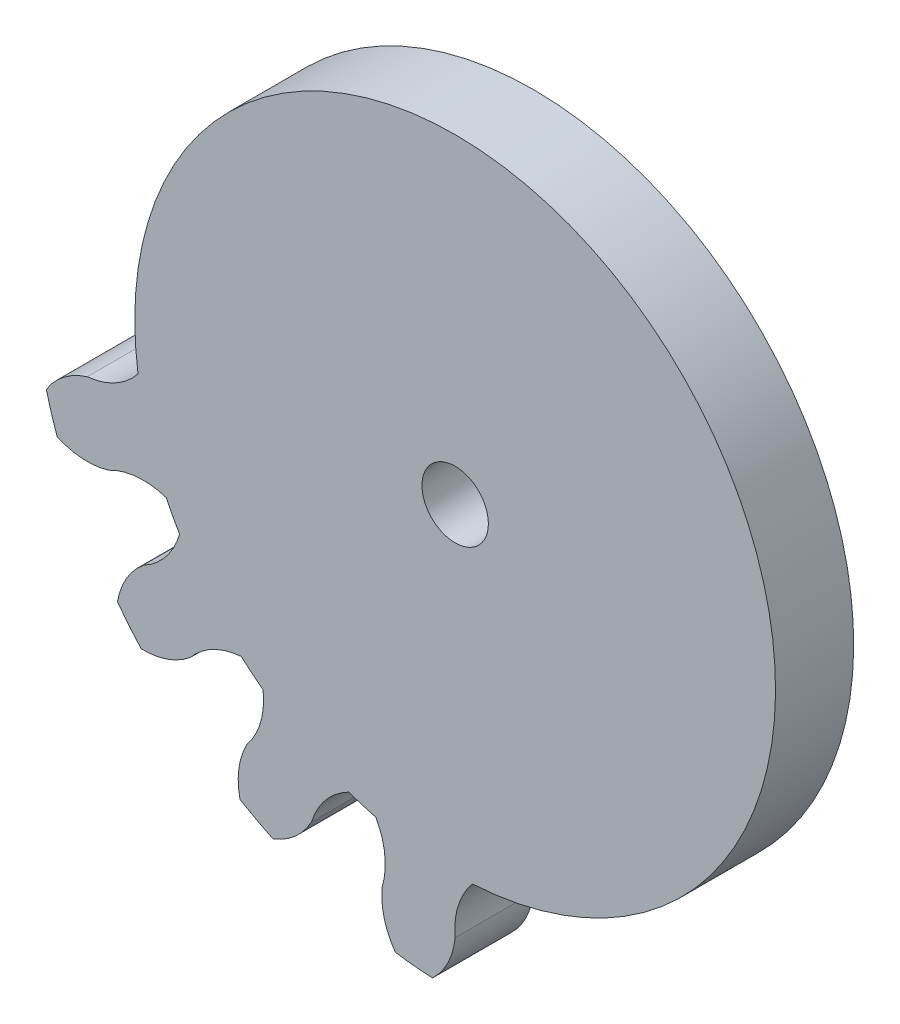
ISO-10303-21;
HEADER;
FILE_DESCRIPTION(('STEP AP214'),'2;1');
FILE_NAME('part.step','',(''),(''),'','','');
FILE_SCHEMA(('AUTOMOTIVE_DESIGN { 1 0 10303 214 1 1 1 1 }'));
ENDSEC;
DATA;
#1=APPLICATION_CONTEXT('core data for automotive mechanical design processes');
#2=APPLICATION_PROTOCOL_DEFINITION('international standard','automotive_design',2000,#1);
#3=PRODUCT_CONTEXT('',#1,'mechanical');
#4=PRODUCT('Part','Part','',(#3));
#5=PRODUCT_RELATED_PRODUCT_CATEGORY('part','',(#4));
#6=PRODUCT_DEFINITION_FORMATION('','',#4);
#7=PRODUCT_DEFINITION_CONTEXT('part definition',#1,'design');
#8=PRODUCT_DEFINITION('design','',#6,#7);
#9=PRODUCT_DEFINITION_SHAPE('','',#8);
#10=(LENGTH_UNIT() NAMED_UNIT(*) SI_UNIT(.MILLI.,.METRE.));
#11=(NAMED_UNIT(*) PLANE_ANGLE_UNIT() SI_UNIT($,.RADIAN.));
#12=(NAMED_UNIT(*) SI_UNIT($,.STERADIAN.) SOLID_ANGLE_UNIT());
#13=UNCERTAINTY_MEASURE_WITH_UNIT(LENGTH_MEASURE(1.E-05),#10,'distance_accuracy_value','');
#14=(GEOMETRIC_REPRESENTATION_CONTEXT(3) GLOBAL_UNCERTAINTY_ASSIGNED_CONTEXT((#13)) GLOBAL_UNIT_ASSIGNED_CONTEXT((#10,
#11,#12)) REPRESENTATION_CONTEXT('',''));
#15=CARTESIAN_POINT('',(0.,0.,0.));
#16=DIRECTION('',(0.,0.,1.));
#17=DIRECTION('',(1.,0.,0.));
#18=AXIS2_PLACEMENT_3D('',#15,#16,#17);
#19=CARTESIAN_POINT('',(0.,0.,10.));
#20=DIRECTION('',(0.,0.,1.));
#21=DIRECTION('',(1.,0.,0.));
#22=AXIS2_PLACEMENT_3D('',#19,#20,#21);
#23=PLANE('',#22);
#24=CARTESIAN_POINT('',(0.,0.,10.));
#25=DIRECTION('',(0.,0.,1.));
#26=DIRECTION('',(1.,0.,0.));
#27=AXIS2_PLACEMENT_3D('',#24,#25,#26);
#28=CIRCLE('',#27,4.25);
#29=CARTESIAN_POINT('',(4.25,0.,10.));
#30=VERTEX_POINT('',#29);
#31=EDGE_CURVE('E409',#30,#30,#28,.T.);
#32=ORIENTED_EDGE('',*,*,#31,.F.);
#33=EDGE_LOOP('',(#32));
#34=FACE_BOUND('',#33,.T.);
#35=CARTESIAN_POINT('',(9.37946745444333,-47.0746809895833,10.));
#36=DIRECTION('',(0.,0.,1.));
#37=DIRECTION('',(-1.,0.,0.));
#38=AXIS2_PLACEMENT_3D('',#35,#36,#37);
#39=CIRCLE('',#38,9.425);
#40=CARTESIAN_POINT('',(2.22645157509393,-40.9375001359849,10.));
#41=VERTEX_POINT('',#40);
#42=CARTESIAN_POINT('',(0.,-48.,10.));
#43=VERTEX_POINT('',#42);
#44=EDGE_CURVE('E335',#41,#43,#39,.T.);
#45=ORIENTED_EDGE('',*,*,#44,.F.);
#46=CARTESIAN_POINT('',(0.,0.,10.));
#47=DIRECTION('',(0.,0.,-1.));
#48=DIRECTION('',(1.,0.,0.));
#49=AXIS2_PLACEMENT_3D('',#46,#47,#48);
#50=CIRCLE('',#49,40.998);
#51=CARTESIAN_POINT('',(-40.5833893645833,-5.81588442823842,10.));
#52=VERTEX_POINT('',#51);
#53=EDGE_CURVE('E240',#52,#41,#50,.T.);
#54=ORIENTED_EDGE('',*,*,#53,.F.);
#55=CARTESIAN_POINT('',(-48.,-1.6759110426447E-13,10.));
#56=DIRECTION('',(0.,0.,1.));
#57=DIRECTION('',(0.,1.,0.));
#58=AXIS2_PLACEMENT_3D('',#55,#56,#57);
#59=CIRCLE('',#58,9.425);
#60=CARTESIAN_POINT('',(-47.0746809895833,-9.37946745444349,10.));
#61=VERTEX_POINT('',#60);
#62=EDGE_CURVE('E317',#61,#52,#59,.T.);
#63=ORIENTED_EDGE('',*,*,#62,.F.);
#64=CARTESIAN_POINT('',(-44.3343995946265,-18.3973099279209,10.));
#65=DIRECTION('',(0.,0.,-1.));
#66=DIRECTION('',(0.,1.,0.));
#67=AXIS2_PLACEMENT_3D('',#64,#65,#66);
#68=CIRCLE('',#67,9.425);
#69=CARTESIAN_POINT('',(-52.3151968362285,-13.3835787436194,10.));
#70=VERTEX_POINT('',#69);
#71=EDGE_CURVE('E287',#70,#61,#68,.T.);
#72=ORIENTED_EDGE('',*,*,#71,.F.);
#73=CARTESIAN_POINT('',(0.,0.,10.));
#74=DIRECTION('',(0.,0.,1.));
#75=DIRECTION('',(1.,0.,0.));
#76=AXIS2_PLACEMENT_3D('',#73,#74,#75);
#77=CIRCLE('',#76,54.);
#78=CARTESIAN_POINT('',(-50.9282462450108,-17.9530981840891,10.));
#79=VERTEX_POINT('',#78);
#80=EDGE_CURVE('E11',#70,#79,#77,.T.);
#81=ORIENTED_EDGE('',*,*,#80,.T.);
#82=CARTESIAN_POINT('',(-47.0807010649972,-9.34920249156967,10.));
#83=DIRECTION('',(0.,0.,-1.));
#84=DIRECTION('',(-0.382683432365094,0.923879532511285,0.));
#85=AXIS2_PLACEMENT_3D('',#82,#83,#84);
#86=CIRCLE('',#85,9.42500000000002);
#87=CARTESIAN_POINT('',(-44.3462175605417,-18.3688047535245,10.));
#88=VERTEX_POINT('',#87);
#89=EDGE_CURVE('E271',#88,#79,#86,.T.);
#90=ORIENTED_EDGE('',*,*,#89,.F.);
#91=CARTESIAN_POINT('',(-39.9019674665511,-26.6801985056015,10.));
#92=DIRECTION('',(0.,0.,1.));
#93=DIRECTION('',(-0.382683432365094,0.923879532511285,0.));
#94=AXIS2_PLACEMENT_3D('',#91,#92,#93);
#95=CIRCLE('',#94,9.425);
#96=CARTESIAN_POINT('',(-36.9692923570628,-17.723076104842,10.));
#97=VERTEX_POINT('',#96);
#98=EDGE_CURVE('E281',#97,#88,#95,.T.);
#99=ORIENTED_EDGE('',*,*,#98,.F.);
#100=CARTESIAN_POINT('',(0.,0.,10.));
#101=DIRECTION('',(0.,0.,-1.));
#102=DIRECTION('',(-0.382683432365094,0.923879532511285,0.));
#103=AXIS2_PLACEMENT_3D('',#100,#101,#102);
#104=CIRCLE('',#103,40.998);
#105=CARTESIAN_POINT('',(-35.2685201786378,-20.9037673257482,10.));
#106=VERTEX_POINT('',#105);
#107=EDGE_CURVE('E273',#106,#97,#104,.T.);
#108=ORIENTED_EDGE('',*,*,#107,.F.);
#109=CARTESIAN_POINT('',(-44.3462175605417,-18.3688047535245,10.));
#110=DIRECTION('',(0.,0.,1.));
#111=DIRECTION('',(-0.382683432365094,0.923879532511285,0.));
#112=AXIS2_PLACEMENT_3D('',#109,#110,#111);
#113=CIRCLE('',#112,9.425);
#114=CARTESIAN_POINT('',(-39.9019674665511,-26.6801985056015,10.));
#115=VERTEX_POINT('',#114);
#116=EDGE_CURVE('E268',#115,#106,#113,.T.);
#117=ORIENTED_EDGE('',*,*,#116,.F.);
#118=CARTESIAN_POINT('',(-33.919298662151,-33.96293830439,10.));
#119=DIRECTION('',(0.,0.,-1.));
#120=DIRECTION('',(-0.382683432365094,0.923879532511285,0.));
#121=AXIS2_PLACEMENT_3D('',#118,#119,#120);
#122=CIRCLE('',#121,9.425);
#123=CARTESIAN_POINT('',(-43.211265745354,-32.3849735631264,10.));
#124=VERTEX_POINT('',#123);
#125=EDGE_CURVE('E265',#124,#115,#122,.T.);
#126=ORIENTED_EDGE('',*,*,#125,.F.);
#127=CARTESIAN_POINT('',(-40.1812110977855,-36.0758960348208,10.));
#128=VERTEX_POINT('',#127);
#129=EDGE_CURVE('E45',#124,#128,#77,.T.);
#130=ORIENTED_EDGE('',*,*,#129,.T.);
#131=CARTESIAN_POINT('',(-39.9191111908831,-26.6545411089726,10.));
#132=DIRECTION('',(0.,0.,-1.));
#133=DIRECTION('',(-0.707106781186551,0.707106781186544,0.));
#134=AXIS2_PLACEMENT_3D('',#131,#132,#133);
#135=CIRCLE('',#134,9.42500000000002);
#136=CARTESIAN_POINT('',(-33.9411254969541,-33.9411254969545,10.));
#137=VERTEX_POINT('',#136);
#138=EDGE_CURVE('E205',#137,#128,#135,.T.);
#139=ORIENTED_EDGE('',*,*,#138,.F.);
#140=CARTESIAN_POINT('',(-26.6545411089722,-39.9191111908834,10.));
#141=DIRECTION('',(0.,0.,1.));
#142=DIRECTION('',(-0.707106781186551,0.707106781186544,0.));
#143=AXIS2_PLACEMENT_3D('',#140,#141,#142);
#144=CIRCLE('',#143,9.425);
#145=CARTESIAN_POINT('',(-27.3728449442476,-30.5215229577126,10.));
#146=VERTEX_POINT('',#145);
#147=EDGE_CURVE('E221',#146,#137,#144,.T.);
#148=ORIENTED_EDGE('',*,*,#147,.F.);
#149=CARTESIAN_POINT('',(0.,0.,10.));
#150=DIRECTION('',(0.,0.,-1.));
#151=DIRECTION('',(-0.707106781186551,0.707106781186544,0.));
#152=AXIS2_PLACEMENT_3D('',#149,#150,#151);
#153=CIRCLE('',#152,40.998);
#154=CARTESIAN_POINT('',(-24.5843385054262,-32.8092411410356,10.));
#155=VERTEX_POINT('',#154);
#156=EDGE_CURVE('E393',#155,#146,#153,.T.);
#157=ORIENTED_EDGE('',*,*,#156,.F.);
#158=CARTESIAN_POINT('',(-33.9411254969541,-33.9411254969545,10.));
#159=DIRECTION('',(0.,0.,1.));
#160=DIRECTION('',(-0.707106781186551,0.707106781186544,0.));
#161=AXIS2_PLACEMENT_3D('',#158,#159,#160);
#162=CIRCLE('',#161,9.425);
#163=CARTESIAN_POINT('',(-26.6545411089722,-39.9191111908834,10.));
#164=VERTEX_POINT('',#163);
#165=EDGE_CURVE('E396',#164,#155,#162,.T.);
#166=ORIENTED_EDGE('',*,*,#165,.F.);
#167=CARTESIAN_POINT('',(-18.340291987571,-44.3580171988181,10.));
#168=DIRECTION('',(0.,0.,-1.));
#169=DIRECTION('',(-0.707106781186551,0.707106781186544,0.));
#170=AXIS2_PLACEMENT_3D('',#167,#168,#169);
#171=CIRCLE('',#170,9.425);
#172=CARTESIAN_POINT('',(-27.5288111558487,-46.4560497281637,10.));
#173=VERTEX_POINT('',#172);
#174=EDGE_CURVE('E399',#173,#164,#171,.T.);
#175=ORIENTED_EDGE('',*,*,#174,.F.);
#176=CARTESIAN_POINT('',(-23.316950804508,-48.7064657430628,10.));
#177=VERTEX_POINT('',#176);
#178=EDGE_CURVE('E251',#173,#177,#77,.T.);
#179=ORIENTED_EDGE('',*,*,#178,.T.);
#180=CARTESIAN_POINT('',(-26.6801985056011,-39.9019674665514,10.));
#181=DIRECTION('',(0.,0.,-1.));
#182=DIRECTION('',(-0.923879532511289,0.382683432365084,0.));
#183=AXIS2_PLACEMENT_3D('',#180,#181,#182);
#184=CIRCLE('',#183,9.42500000000002);
#185=CARTESIAN_POINT('',(-18.368804753524,-44.3462175605419,10.));
#186=VERTEX_POINT('',#185);
#187=EDGE_CURVE('E334',#186,#177,#184,.T.);
#188=ORIENTED_EDGE('',*,*,#187,.F.);
#189=CARTESIAN_POINT('',(-9.34920249156917,-47.0807010649973,10.));
#190=DIRECTION('',(0.,0.,1.));
#191=DIRECTION('',(-0.923879532511289,0.382683432365084,0.));
#192=AXIS2_PLACEMENT_3D('',#189,#190,#191);
#193=CIRCLE('',#192,9.425);
#194=CARTESIAN_POINT('',(-13.609130024128,-38.6733446185661,10.));
#195=VERTEX_POINT('',#194);
#196=EDGE_CURVE('E358',#195,#186,#193,.T.);
#197=ORIENTED_EDGE('',*,*,#196,.F.);
#198=CARTESIAN_POINT('',(0.,0.,10.));
#199=DIRECTION('',(0.,0.,-1.));
#200=DIRECTION('',(-0.923879532511289,0.382683432365084,0.));
#201=AXIS2_PLACEMENT_3D('',#198,#199,#200);
#202=CIRCLE('',#201,40.998);
#203=CARTESIAN_POINT('',(-10.1574141523469,-39.7198054091117,10.));
#204=VERTEX_POINT('',#203);
#205=EDGE_CURVE('E362',#204,#195,#202,.T.);
#206=ORIENTED_EDGE('',*,*,#205,.F.);
#207=CARTESIAN_POINT('',(-18.368804753524,-44.3462175605419,10.));
#208=DIRECTION('',(0.,0.,1.));
#209=DIRECTION('',(-0.923879532511289,0.382683432365084,0.));
#210=AXIS2_PLACEMENT_3D('',#207,#208,#209);
#211=CIRCLE('',#210,9.425);
#212=CARTESIAN_POINT('',(-9.34920249156917,-47.0807010649973,10.));
#213=VERTEX_POINT('',#212);
#214=EDGE_CURVE('E365',#213,#204,#211,.T.);
#215=ORIENTED_EDGE('',*,*,#214,.F.);
#216=CARTESIAN_POINT('',(0.0308578869558512,-47.9999900811533,10.));
#217=DIRECTION('',(0.,0.,-1.));
#218=DIRECTION('',(-0.923879532511289,0.382683432365084,0.));
#219=AXIS2_PLACEMENT_3D('',#216,#217,#218);
#220=CIRCLE('',#219,9.425);
#221=CARTESIAN_POINT('',(-7.65534461715999,-53.4546134472275,10.));
#222=VERTEX_POINT('',#221);
#223=EDGE_CURVE('E368',#222,#213,#220,.T.);
#224=ORIENTED_EDGE('',*,*,#223,.F.);
#225=CARTESIAN_POINT('',(-2.90289611992996,-53.9219175671349,10.));
#226=VERTEX_POINT('',#225);
#227=EDGE_CURVE('E46',#222,#226,#77,.T.);
#228=ORIENTED_EDGE('',*,*,#227,.T.);
#229=CARTESIAN_POINT('',(-9.37946745444333,-47.0746809895833,10.));
#230=DIRECTION('',(0.,0.,-1.));
#231=DIRECTION('',(-1.,0.,0.));
#232=AXIS2_PLACEMENT_3D('',#229,#230,#231);
#233=CIRCLE('',#232,9.42500000000002);
#234=EDGE_CURVE('E339',#43,#226,#233,.T.);
#235=ORIENTED_EDGE('',*,*,#234,.F.);
#236=EDGE_LOOP('',(#45,#54,#63,#72,#81,#90,#99,#108,#117,#126,#130,#139,#148,#157,#166,#175,
#179,#188,#197,#206,#215,#224,#228,#235));
#237=FACE_BOUND('',#236,.T.);
#238=ADVANCED_FACE('F36',(#34,#237),#23,.T.);
#239=CARTESIAN_POINT('',(0.,0.,0.));
#240=DIRECTION('',(0.,0.,1.));
#241=DIRECTION('',(1.,0.,0.));
#242=AXIS2_PLACEMENT_3D('',#239,#240,#241);
#243=PLANE('',#242);
#244=CARTESIAN_POINT('',(0.,0.,0.));
#245=DIRECTION('',(0.,0.,1.));
#246=DIRECTION('',(1.,0.,0.));
#247=AXIS2_PLACEMENT_3D('',#244,#245,#246);
#248=CIRCLE('',#247,4.25);
#249=CARTESIAN_POINT('',(4.25,0.,0.));
#250=VERTEX_POINT('',#249);
#251=EDGE_CURVE('E341',#250,#250,#248,.T.);
#252=ORIENTED_EDGE('',*,*,#251,.T.);
#253=EDGE_LOOP('',(#252));
#254=FACE_BOUND('',#253,.T.);
#255=CARTESIAN_POINT('',(0.,0.,0.));
#256=DIRECTION('',(0.,0.,-1.));
#257=DIRECTION('',(1.,0.,0.));
#258=AXIS2_PLACEMENT_3D('',#255,#256,#257);
#259=CIRCLE('',#258,40.998);
#260=CARTESIAN_POINT('',(-40.5833893645833,-5.81588442823842,0.));
#261=VERTEX_POINT('',#260);
#262=CARTESIAN_POINT('',(2.22645157509393,-40.9375001359849,0.));
#263=VERTEX_POINT('',#262);
#264=EDGE_CURVE('E235',#261,#263,#259,.T.);
#265=ORIENTED_EDGE('',*,*,#264,.T.);
#266=CARTESIAN_POINT('',(9.37946745444333,-47.0746809895833,0.));
#267=DIRECTION('',(0.,0.,1.));
#268=DIRECTION('',(-1.,0.,0.));
#269=AXIS2_PLACEMENT_3D('',#266,#267,#268);
#270=CIRCLE('',#269,9.425);
#271=CARTESIAN_POINT('',(0.,-48.,0.));
#272=VERTEX_POINT('',#271);
#273=EDGE_CURVE('E329',#263,#272,#270,.T.);
#274=ORIENTED_EDGE('',*,*,#273,.T.);
#275=CARTESIAN_POINT('',(-9.37946745444333,-47.0746809895833,0.));
#276=DIRECTION('',(0.,0.,-1.));
#277=DIRECTION('',(-1.,0.,0.));
#278=AXIS2_PLACEMENT_3D('',#275,#276,#277);
#279=CIRCLE('',#278,9.42500000000002);
#280=CARTESIAN_POINT('',(-2.90289611992996,-53.9219175671349,0.));
#281=VERTEX_POINT('',#280);
#282=EDGE_CURVE('E338',#272,#281,#279,.T.);
#283=ORIENTED_EDGE('',*,*,#282,.T.);
#284=CARTESIAN_POINT('',(0.,0.,0.));
#285=DIRECTION('',(0.,0.,1.));
#286=DIRECTION('',(1.,0.,0.));
#287=AXIS2_PLACEMENT_3D('',#284,#285,#286);
#288=CIRCLE('',#287,54.);
#289=CARTESIAN_POINT('',(-7.65534461715999,-53.4546134472275,0.));
#290=VERTEX_POINT('',#289);
#291=EDGE_CURVE('E40',#290,#281,#288,.T.);
#292=ORIENTED_EDGE('',*,*,#291,.F.);
#293=CARTESIAN_POINT('',(0.0308578869558512,-47.9999900811533,0.));
#294=DIRECTION('',(0.,0.,-1.));
#295=DIRECTION('',(-0.923879532511289,0.382683432365084,0.));
#296=AXIS2_PLACEMENT_3D('',#293,#294,#295);
#297=CIRCLE('',#296,9.425);
#298=CARTESIAN_POINT('',(-9.34920249156917,-47.0807010649973,0.));
#299=VERTEX_POINT('',#298);
#300=EDGE_CURVE('E378',#290,#299,#297,.T.);
#301=ORIENTED_EDGE('',*,*,#300,.T.);
#302=CARTESIAN_POINT('',(-18.368804753524,-44.3462175605419,0.));
#303=DIRECTION('',(0.,0.,1.));
#304=DIRECTION('',(-0.923879532511289,0.382683432365084,0.));
#305=AXIS2_PLACEMENT_3D('',#302,#303,#304);
#306=CIRCLE('',#305,9.425);
#307=CARTESIAN_POINT('',(-10.1574141523469,-39.7198054091117,0.));
#308=VERTEX_POINT('',#307);
#309=EDGE_CURVE('E53',#299,#308,#306,.T.);
#310=ORIENTED_EDGE('',*,*,#309,.T.);
#311=CARTESIAN_POINT('',(0.,0.,0.));
#312=DIRECTION('',(0.,0.,-1.));
#313=DIRECTION('',(-0.923879532511289,0.382683432365084,0.));
#314=AXIS2_PLACEMENT_3D('',#311,#312,#313);
#315=CIRCLE('',#314,40.998);
#316=CARTESIAN_POINT('',(-13.609130024128,-38.6733446185661,0.));
#317=VERTEX_POINT('',#316);
#318=EDGE_CURVE('E374',#308,#317,#315,.T.);
#319=ORIENTED_EDGE('',*,*,#318,.T.);
#320=CARTESIAN_POINT('',(-9.34920249156917,-47.0807010649973,0.));
#321=DIRECTION('',(0.,0.,1.));
#322=DIRECTION('',(-0.923879532511289,0.382683432365084,0.));
#323=AXIS2_PLACEMENT_3D('',#320,#321,#322);
#324=CIRCLE('',#323,9.425);
#325=CARTESIAN_POINT('',(-18.368804753524,-44.3462175605419,0.));
#326=VERTEX_POINT('',#325);
#327=EDGE_CURVE('E348',#317,#326,#324,.T.);
#328=ORIENTED_EDGE('',*,*,#327,.T.);
#329=CARTESIAN_POINT('',(-26.6801985056011,-39.9019674665514,0.));
#330=DIRECTION('',(0.,0.,-1.));
#331=DIRECTION('',(-0.923879532511289,0.382683432365084,0.));
#332=AXIS2_PLACEMENT_3D('',#329,#330,#331);
#333=CIRCLE('',#332,9.42500000000002);
#334=CARTESIAN_POINT('',(-23.316950804508,-48.7064657430628,0.));
#335=VERTEX_POINT('',#334);
#336=EDGE_CURVE('E361',#326,#335,#333,.T.);
#337=ORIENTED_EDGE('',*,*,#336,.T.);
#338=CARTESIAN_POINT('',(-27.5288111558487,-46.4560497281637,0.));
#339=VERTEX_POINT('',#338);
#340=EDGE_CURVE('E227',#339,#335,#288,.T.);
#341=ORIENTED_EDGE('',*,*,#340,.F.);
#342=CARTESIAN_POINT('',(-18.340291987571,-44.3580171988181,0.));
#343=DIRECTION('',(0.,0.,-1.));
#344=DIRECTION('',(-0.707106781186551,0.707106781186544,0.));
#345=AXIS2_PLACEMENT_3D('',#342,#343,#344);
#346=CIRCLE('',#345,9.425);
#347=CARTESIAN_POINT('',(-26.6545411089722,-39.9191111908834,0.));
#348=VERTEX_POINT('',#347);
#349=EDGE_CURVE('E220',#339,#348,#346,.T.);
#350=ORIENTED_EDGE('',*,*,#349,.T.);
#351=CARTESIAN_POINT('',(-33.9411254969541,-33.9411254969545,0.));
#352=DIRECTION('',(0.,0.,1.));
#353=DIRECTION('',(-0.707106781186551,0.707106781186544,0.));
#354=AXIS2_PLACEMENT_3D('',#351,#352,#353);
#355=CIRCLE('',#354,9.425);
#356=CARTESIAN_POINT('',(-24.5843385054262,-32.8092411410356,0.));
#357=VERTEX_POINT('',#356);
#358=EDGE_CURVE('E61',#348,#357,#355,.T.);
#359=ORIENTED_EDGE('',*,*,#358,.T.);
#360=CARTESIAN_POINT('',(0.,0.,0.));
#361=DIRECTION('',(0.,0.,-1.));
#362=DIRECTION('',(-0.707106781186551,0.707106781186544,0.));
#363=AXIS2_PLACEMENT_3D('',#360,#361,#362);
#364=CIRCLE('',#363,40.998);
#365=CARTESIAN_POINT('',(-27.3728449442476,-30.5215229577126,0.));
#366=VERTEX_POINT('',#365);
#367=EDGE_CURVE('E404',#357,#366,#364,.T.);
#368=ORIENTED_EDGE('',*,*,#367,.T.);
#369=CARTESIAN_POINT('',(-26.6545411089722,-39.9191111908834,0.));
#370=DIRECTION('',(0.,0.,1.));
#371=DIRECTION('',(-0.707106781186551,0.707106781186544,0.));
#372=AXIS2_PLACEMENT_3D('',#369,#370,#371);
#373=CIRCLE('',#372,9.425);
#374=CARTESIAN_POINT('',(-33.9411254969541,-33.9411254969545,0.));
#375=VERTEX_POINT('',#374);
#376=EDGE_CURVE('E211',#366,#375,#373,.T.);
#377=ORIENTED_EDGE('',*,*,#376,.T.);
#378=CARTESIAN_POINT('',(-39.9191111908831,-26.6545411089726,0.));
#379=DIRECTION('',(0.,0.,-1.));
#380=DIRECTION('',(-0.707106781186551,0.707106781186544,0.));
#381=AXIS2_PLACEMENT_3D('',#378,#379,#380);
#382=CIRCLE('',#381,9.42500000000002);
#383=CARTESIAN_POINT('',(-40.1812110977855,-36.0758960348208,0.));
#384=VERTEX_POINT('',#383);
#385=EDGE_CURVE('E202',#375,#384,#382,.T.);
#386=ORIENTED_EDGE('',*,*,#385,.T.);
#387=CARTESIAN_POINT('',(-43.211265745354,-32.3849735631264,0.));
#388=VERTEX_POINT('',#387);
#389=EDGE_CURVE('E217',#388,#384,#288,.T.);
#390=ORIENTED_EDGE('',*,*,#389,.F.);
#391=CARTESIAN_POINT('',(-33.919298662151,-33.96293830439,0.));
#392=DIRECTION('',(0.,0.,-1.));
#393=DIRECTION('',(-0.382683432365094,0.923879532511285,0.));
#394=AXIS2_PLACEMENT_3D('',#391,#392,#393);
#395=CIRCLE('',#394,9.425);
#396=CARTESIAN_POINT('',(-39.9019674665511,-26.6801985056015,0.));
#397=VERTEX_POINT('',#396);
#398=EDGE_CURVE('E307',#388,#397,#395,.T.);
#399=ORIENTED_EDGE('',*,*,#398,.T.);
#400=CARTESIAN_POINT('',(-44.3462175605417,-18.3688047535245,0.));
#401=DIRECTION('',(0.,0.,1.));
#402=DIRECTION('',(-0.382683432365094,0.923879532511285,0.));
#403=AXIS2_PLACEMENT_3D('',#400,#401,#402);
#404=CIRCLE('',#403,9.425);
#405=CARTESIAN_POINT('',(-35.2685201786378,-20.9037673257482,0.));
#406=VERTEX_POINT('',#405);
#407=EDGE_CURVE('E302',#397,#406,#404,.T.);
#408=ORIENTED_EDGE('',*,*,#407,.T.);
#409=CARTESIAN_POINT('',(0.,0.,0.));
#410=DIRECTION('',(0.,0.,-1.));
#411=DIRECTION('',(-0.382683432365094,0.923879532511285,0.));
#412=AXIS2_PLACEMENT_3D('',#409,#410,#411);
#413=CIRCLE('',#412,40.998);
#414=CARTESIAN_POINT('',(-36.9692923570628,-17.723076104842,0.));
#415=VERTEX_POINT('',#414);
#416=EDGE_CURVE('E298',#406,#415,#413,.T.);
#417=ORIENTED_EDGE('',*,*,#416,.T.);
#418=CARTESIAN_POINT('',(-39.9019674665511,-26.6801985056015,0.));
#419=DIRECTION('',(0.,0.,1.));
#420=DIRECTION('',(-0.382683432365094,0.923879532511285,0.));
#421=AXIS2_PLACEMENT_3D('',#418,#419,#420);
#422=CIRCLE('',#421,9.425);
#423=CARTESIAN_POINT('',(-44.3462175605417,-18.3688047535245,0.));
#424=VERTEX_POINT('',#423);
#425=EDGE_CURVE('E294',#415,#424,#422,.T.);
#426=ORIENTED_EDGE('',*,*,#425,.T.);
#427=CARTESIAN_POINT('',(-47.0807010649972,-9.34920249156967,0.));
#428=DIRECTION('',(0.,0.,-1.));
#429=DIRECTION('',(-0.382683432365094,0.923879532511285,0.));
#430=AXIS2_PLACEMENT_3D('',#427,#428,#429);
#431=CIRCLE('',#430,9.42500000000002);
#432=CARTESIAN_POINT('',(-50.9282462450108,-17.9530981840891,0.));
#433=VERTEX_POINT('',#432);
#434=EDGE_CURVE('E284',#424,#433,#431,.T.);
#435=ORIENTED_EDGE('',*,*,#434,.T.);
#436=CARTESIAN_POINT('',(-52.3151968362285,-13.3835787436194,0.));
#437=VERTEX_POINT('',#436);
#438=EDGE_CURVE('E226',#437,#433,#288,.T.);
#439=ORIENTED_EDGE('',*,*,#438,.F.);
#440=CARTESIAN_POINT('',(-44.3343995946265,-18.3973099279209,0.));
#441=DIRECTION('',(0.,0.,-1.));
#442=DIRECTION('',(0.,1.,0.));
#443=AXIS2_PLACEMENT_3D('',#440,#441,#442);
#444=CIRCLE('',#443,9.425);
#445=CARTESIAN_POINT('',(-47.0746809895833,-9.37946745444349,0.));
#446=VERTEX_POINT('',#445);
#447=EDGE_CURVE('E320',#437,#446,#444,.T.);
#448=ORIENTED_EDGE('',*,*,#447,.T.);
#449=CARTESIAN_POINT('',(-48.,-1.6759110426447E-13,0.));
#450=DIRECTION('',(0.,0.,1.));
#451=DIRECTION('',(0.,1.,0.));
#452=AXIS2_PLACEMENT_3D('',#449,#450,#451);
#453=CIRCLE('',#452,9.425);
#454=EDGE_CURVE('E313',#446,#261,#453,.T.);
#455=ORIENTED_EDGE('',*,*,#454,.T.);
#456=EDGE_LOOP('',(#265,#274,#283,#292,#301,#310,#319,#328,#337,#341,#350,#359,#368,#377,#386,
#390,#399,#408,#417,#426,#435,#439,#448,#455));
#457=FACE_BOUND('',#456,.T.);
#458=ADVANCED_FACE('F215',(#254,#457),#243,.F.);
#459=CARTESIAN_POINT('',(0.,0.,10.));
#460=DIRECTION('',(0.,0.,-1.));
#461=DIRECTION('',(-1.,0.,0.));
#462=AXIS2_PLACEMENT_3D('',#459,#460,#461);
#463=CYLINDRICAL_SURFACE('',#462,54.);
#464=ORIENTED_EDGE('',*,*,#291,.T.);
#465=DIRECTION('',(0.,0.,1.));
#466=VECTOR('',#465,1.);
#467=CARTESIAN_POINT('',(-2.90289611992996,-53.9219175671349,0.));
#468=LINE('',#467,#466);
#469=EDGE_CURVE('E326',#281,#226,#468,.T.);
#470=ORIENTED_EDGE('',*,*,#469,.T.);
#471=ORIENTED_EDGE('',*,*,#227,.F.);
#472=DIRECTION('',(0.,0.,1.));
#473=VECTOR('',#472,1.);
#474=CARTESIAN_POINT('',(-7.65534461715999,-53.4546134472275,0.));
#475=LINE('',#474,#473);
#476=EDGE_CURVE('E347',#290,#222,#475,.T.);
#477=ORIENTED_EDGE('',*,*,#476,.F.);
#478=EDGE_LOOP('',(#464,#470,#471,#477));
#479=FACE_BOUND('',#478,.T.);
#480=ADVANCED_FACE('F38',(#479),#463,.T.);
#481=ORIENTED_EDGE('',*,*,#340,.T.);
#482=DIRECTION('',(0.,0.,1.));
#483=VECTOR('',#482,1.);
#484=CARTESIAN_POINT('',(-23.316950804508,-48.7064657430628,0.));
#485=LINE('',#484,#483);
#486=EDGE_CURVE('E345',#335,#177,#485,.T.);
#487=ORIENTED_EDGE('',*,*,#486,.T.);
#488=ORIENTED_EDGE('',*,*,#178,.F.);
#489=DIRECTION('',(0.,0.,1.));
#490=VECTOR('',#489,1.);
#491=CARTESIAN_POINT('',(-27.5288111558487,-46.4560497281637,0.));
#492=LINE('',#491,#490);
#493=EDGE_CURVE('E210',#339,#173,#492,.T.);
#494=ORIENTED_EDGE('',*,*,#493,.F.);
#495=EDGE_LOOP('',(#481,#487,#488,#494));
#496=FACE_BOUND('',#495,.T.);
#497=ADVANCED_FACE('F508',(#496),#463,.T.);
#498=ORIENTED_EDGE('',*,*,#389,.T.);
#499=DIRECTION('',(0.,0.,1.));
#500=VECTOR('',#499,1.);
#501=CARTESIAN_POINT('',(-40.1812110977855,-36.0758960348208,0.));
#502=LINE('',#501,#500);
#503=EDGE_CURVE('E199',#384,#128,#502,.T.);
#504=ORIENTED_EDGE('',*,*,#503,.T.);
#505=ORIENTED_EDGE('',*,*,#129,.F.);
#506=DIRECTION('',(0.,0.,1.));
#507=VECTOR('',#506,1.);
#508=CARTESIAN_POINT('',(-43.211265745354,-32.3849735631264,0.));
#509=LINE('',#508,#507);
#510=EDGE_CURVE('E225',#388,#124,#509,.T.);
#511=ORIENTED_EDGE('',*,*,#510,.F.);
#512=EDGE_LOOP('',(#498,#504,#505,#511));
#513=FACE_BOUND('',#512,.T.);
#514=ADVANCED_FACE('F224',(#513),#463,.T.);
#515=ORIENTED_EDGE('',*,*,#438,.T.);
#516=DIRECTION('',(0.,0.,1.));
#517=VECTOR('',#516,1.);
#518=CARTESIAN_POINT('',(-50.9282462450108,-17.9530981840891,0.));
#519=LINE('',#518,#517);
#520=EDGE_CURVE('E248',#433,#79,#519,.T.);
#521=ORIENTED_EDGE('',*,*,#520,.T.);
#522=ORIENTED_EDGE('',*,*,#80,.F.);
#523=DIRECTION('',(0.,0.,1.));
#524=VECTOR('',#523,1.);
#525=CARTESIAN_POINT('',(-52.3151968362285,-13.3835787436194,0.));
#526=LINE('',#525,#524);
#527=EDGE_CURVE('E310',#437,#70,#526,.T.);
#528=ORIENTED_EDGE('',*,*,#527,.F.);
#529=EDGE_LOOP('',(#515,#521,#522,#528));
#530=FACE_BOUND('',#529,.T.);
#531=ADVANCED_FACE('F433',(#530),#463,.T.);
#532=CARTESIAN_POINT('',(0.,0.,0.));
#533=DIRECTION('',(0.,0.,1.));
#534=DIRECTION('',(1.,0.,0.));
#535=AXIS2_PLACEMENT_3D('',#532,#533,#534);
#536=CYLINDRICAL_SURFACE('',#535,40.998);
#537=ORIENTED_EDGE('',*,*,#53,.T.);
#538=DIRECTION('',(0.,0.,1.));
#539=VECTOR('',#538,1.);
#540=CARTESIAN_POINT('',(2.22645157509393,-40.9375001359849,0.));
#541=LINE('',#540,#539);
#542=EDGE_CURVE('E328',#263,#41,#541,.T.);
#543=ORIENTED_EDGE('',*,*,#542,.F.);
#544=ORIENTED_EDGE('',*,*,#264,.F.);
#545=DIRECTION('',(0.,0.,1.));
#546=VECTOR('',#545,1.);
#547=CARTESIAN_POINT('',(-40.5833893645833,-5.81588442823842,0.));
#548=LINE('',#547,#546);
#549=EDGE_CURVE('E245',#261,#52,#548,.T.);
#550=ORIENTED_EDGE('',*,*,#549,.T.);
#551=EDGE_LOOP('',(#537,#543,#544,#550));
#552=FACE_BOUND('',#551,.T.);
#553=ADVANCED_FACE('F429',(#552),#536,.T.);
#554=CARTESIAN_POINT('',(-48.,-1.6759110426447E-13,0.));
#555=DIRECTION('',(0.,0.,1.));
#556=DIRECTION('',(1.,0.,0.));
#557=AXIS2_PLACEMENT_3D('',#554,#555,#556);
#558=CYLINDRICAL_SURFACE('',#557,9.425);
#559=ORIENTED_EDGE('',*,*,#62,.T.);
#560=ORIENTED_EDGE('',*,*,#549,.F.);
#561=ORIENTED_EDGE('',*,*,#454,.F.);
#562=DIRECTION('',(0.,0.,1.));
#563=VECTOR('',#562,1.);
#564=CARTESIAN_POINT('',(-47.0746809895833,-9.37946745444349,0.));
#565=LINE('',#564,#563);
#566=EDGE_CURVE('E312',#446,#61,#565,.T.);
#567=ORIENTED_EDGE('',*,*,#566,.T.);
#568=EDGE_LOOP('',(#559,#560,#561,#567));
#569=FACE_BOUND('',#568,.T.);
#570=ADVANCED_FACE('F432',(#569),#558,.F.);
#571=CARTESIAN_POINT('',(-44.3343995946265,-18.3973099279209,0.));
#572=DIRECTION('',(0.,0.,1.));
#573=DIRECTION('',(1.,0.,0.));
#574=AXIS2_PLACEMENT_3D('',#571,#572,#573);
#575=CYLINDRICAL_SURFACE('',#574,9.425);
#576=ORIENTED_EDGE('',*,*,#71,.T.);
#577=ORIENTED_EDGE('',*,*,#566,.F.);
#578=ORIENTED_EDGE('',*,*,#447,.F.);
#579=ORIENTED_EDGE('',*,*,#527,.T.);
#580=EDGE_LOOP('',(#576,#577,#578,#579));
#581=FACE_BOUND('',#580,.T.);
#582=ADVANCED_FACE('F439',(#581),#575,.T.);
#583=CARTESIAN_POINT('',(-47.0807010649972,-9.34920249156967,0.));
#584=DIRECTION('',(0.,0.,1.));
#585=DIRECTION('',(1.,0.,0.));
#586=AXIS2_PLACEMENT_3D('',#583,#584,#585);
#587=CYLINDRICAL_SURFACE('',#586,9.42500000000002);
#588=ORIENTED_EDGE('',*,*,#89,.T.);
#589=ORIENTED_EDGE('',*,*,#520,.F.);
#590=ORIENTED_EDGE('',*,*,#434,.F.);
#591=DIRECTION('',(0.,0.,1.));
#592=VECTOR('',#591,1.);
#593=CARTESIAN_POINT('',(-44.3462175605417,-18.3688047535245,0.));
#594=LINE('',#593,#592);
#595=EDGE_CURVE('E285',#424,#88,#594,.T.);
#596=ORIENTED_EDGE('',*,*,#595,.T.);
#597=EDGE_LOOP('',(#588,#589,#590,#596));
#598=FACE_BOUND('',#597,.T.);
#599=ADVANCED_FACE('F435',(#598),#587,.T.);
#600=CARTESIAN_POINT('',(-39.9019674665511,-26.6801985056015,0.));
#601=DIRECTION('',(0.,0.,1.));
#602=DIRECTION('',(1.,0.,0.));
#603=AXIS2_PLACEMENT_3D('',#600,#601,#602);
#604=CYLINDRICAL_SURFACE('',#603,9.425);
#605=ORIENTED_EDGE('',*,*,#98,.T.);
#606=ORIENTED_EDGE('',*,*,#595,.F.);
#607=ORIENTED_EDGE('',*,*,#425,.F.);
#608=DIRECTION('',(0.,0.,1.));
#609=VECTOR('',#608,1.);
#610=CARTESIAN_POINT('',(-36.9692923570628,-17.723076104842,0.));
#611=LINE('',#610,#609);
#612=EDGE_CURVE('E288',#415,#97,#611,.T.);
#613=ORIENTED_EDGE('',*,*,#612,.T.);
#614=EDGE_LOOP('',(#605,#606,#607,#613));
#615=FACE_BOUND('',#614,.T.);
#616=ADVANCED_FACE('F438',(#615),#604,.F.);
#617=CARTESIAN_POINT('',(0.,0.,0.));
#618=DIRECTION('',(0.,0.,1.));
#619=DIRECTION('',(1.,0.,0.));
#620=AXIS2_PLACEMENT_3D('',#617,#618,#619);
#621=CYLINDRICAL_SURFACE('',#620,40.998);
#622=ORIENTED_EDGE('',*,*,#107,.T.);
#623=ORIENTED_EDGE('',*,*,#612,.F.);
#624=ORIENTED_EDGE('',*,*,#416,.F.);
#625=DIRECTION('',(0.,0.,1.));
#626=VECTOR('',#625,1.);
#627=CARTESIAN_POINT('',(-35.2685201786378,-20.9037673257482,0.));
#628=LINE('',#627,#626);
#629=EDGE_CURVE('E290',#406,#106,#628,.T.);
#630=ORIENTED_EDGE('',*,*,#629,.T.);
#631=EDGE_LOOP('',(#622,#623,#624,#630));
#632=FACE_BOUND('',#631,.T.);
#633=ADVANCED_FACE('F447',(#632),#621,.T.);
#634=CARTESIAN_POINT('',(-44.3462175605417,-18.3688047535245,0.));
#635=DIRECTION('',(0.,0.,1.));
#636=DIRECTION('',(1.,0.,0.));
#637=AXIS2_PLACEMENT_3D('',#634,#635,#636);
#638=CYLINDRICAL_SURFACE('',#637,9.425);
#639=ORIENTED_EDGE('',*,*,#116,.T.);
#640=ORIENTED_EDGE('',*,*,#629,.F.);
#641=ORIENTED_EDGE('',*,*,#407,.F.);
#642=DIRECTION('',(0.,0.,1.));
#643=VECTOR('',#642,1.);
#644=CARTESIAN_POINT('',(-39.9019674665511,-26.6801985056015,0.));
#645=LINE('',#644,#643);
#646=EDGE_CURVE('E292',#397,#115,#645,.T.);
#647=ORIENTED_EDGE('',*,*,#646,.T.);
#648=EDGE_LOOP('',(#639,#640,#641,#647));
#649=FACE_BOUND('',#648,.T.);
#650=ADVANCED_FACE('F444',(#649),#638,.F.);
#651=CARTESIAN_POINT('',(-33.919298662151,-33.96293830439,0.));
#652=DIRECTION('',(0.,0.,1.));
#653=DIRECTION('',(1.,0.,0.));
#654=AXIS2_PLACEMENT_3D('',#651,#652,#653);
#655=CYLINDRICAL_SURFACE('',#654,9.425);
#656=ORIENTED_EDGE('',*,*,#125,.T.);
#657=ORIENTED_EDGE('',*,*,#646,.F.);
#658=ORIENTED_EDGE('',*,*,#398,.F.);
#659=ORIENTED_EDGE('',*,*,#510,.T.);
#660=EDGE_LOOP('',(#656,#657,#658,#659));
#661=FACE_BOUND('',#660,.T.);
#662=ADVANCED_FACE('F441',(#661),#655,.T.);
#663=CARTESIAN_POINT('',(-39.9191111908831,-26.6545411089726,0.));
#664=DIRECTION('',(0.,0.,1.));
#665=DIRECTION('',(1.,0.,0.));
#666=AXIS2_PLACEMENT_3D('',#663,#664,#665);
#667=CYLINDRICAL_SURFACE('',#666,9.42500000000002);
#668=ORIENTED_EDGE('',*,*,#138,.T.);
#669=ORIENTED_EDGE('',*,*,#503,.F.);
#670=ORIENTED_EDGE('',*,*,#385,.F.);
#671=DIRECTION('',(0.,0.,1.));
#672=VECTOR('',#671,1.);
#673=CARTESIAN_POINT('',(-33.9411254969541,-33.9411254969545,0.));
#674=LINE('',#673,#672);
#675=EDGE_CURVE('E275',#375,#137,#674,.T.);
#676=ORIENTED_EDGE('',*,*,#675,.T.);
#677=EDGE_LOOP('',(#668,#669,#670,#676));
#678=FACE_BOUND('',#677,.T.);
#679=ADVANCED_FACE('F201',(#678),#667,.T.);
#680=CARTESIAN_POINT('',(-26.6545411089722,-39.9191111908834,0.));
#681=DIRECTION('',(0.,0.,1.));
#682=DIRECTION('',(1.,0.,0.));
#683=AXIS2_PLACEMENT_3D('',#680,#681,#682);
#684=CYLINDRICAL_SURFACE('',#683,9.425);
#685=ORIENTED_EDGE('',*,*,#147,.T.);
#686=ORIENTED_EDGE('',*,*,#675,.F.);
#687=ORIENTED_EDGE('',*,*,#376,.F.);
#688=DIRECTION('',(0.,0.,1.));
#689=VECTOR('',#688,1.);
#690=CARTESIAN_POINT('',(-27.3728449442476,-30.5215229577126,0.));
#691=LINE('',#690,#689);
#692=EDGE_CURVE('E388',#366,#146,#691,.T.);
#693=ORIENTED_EDGE('',*,*,#692,.T.);
#694=EDGE_LOOP('',(#685,#686,#687,#693));
#695=FACE_BOUND('',#694,.T.);
#696=ADVANCED_FACE('F490',(#695),#684,.F.);
#697=CARTESIAN_POINT('',(0.,0.,0.));
#698=DIRECTION('',(0.,0.,1.));
#699=DIRECTION('',(1.,0.,0.));
#700=AXIS2_PLACEMENT_3D('',#697,#698,#699);
#701=CYLINDRICAL_SURFACE('',#700,40.998);
#702=ORIENTED_EDGE('',*,*,#156,.T.);
#703=ORIENTED_EDGE('',*,*,#692,.F.);
#704=ORIENTED_EDGE('',*,*,#367,.F.);
#705=DIRECTION('',(0.,0.,1.));
#706=VECTOR('',#705,1.);
#707=CARTESIAN_POINT('',(-24.5843385054262,-32.8092411410356,0.));
#708=LINE('',#707,#706);
#709=EDGE_CURVE('E386',#357,#155,#708,.T.);
#710=ORIENTED_EDGE('',*,*,#709,.T.);
#711=EDGE_LOOP('',(#702,#703,#704,#710));
#712=FACE_BOUND('',#711,.T.);
#713=ADVANCED_FACE('F497',(#712),#701,.T.);
#714=CARTESIAN_POINT('',(-33.9411254969541,-33.9411254969545,0.));
#715=DIRECTION('',(0.,0.,1.));
#716=DIRECTION('',(1.,0.,0.));
#717=AXIS2_PLACEMENT_3D('',#714,#715,#716);
#718=CYLINDRICAL_SURFACE('',#717,9.425);
#719=ORIENTED_EDGE('',*,*,#165,.T.);
#720=ORIENTED_EDGE('',*,*,#709,.F.);
#721=ORIENTED_EDGE('',*,*,#358,.F.);
#722=DIRECTION('',(0.,0.,1.));
#723=VECTOR('',#722,1.);
#724=CARTESIAN_POINT('',(-26.6545411089722,-39.9191111908834,0.));
#725=LINE('',#724,#723);
#726=EDGE_CURVE('E384',#348,#164,#725,.T.);
#727=ORIENTED_EDGE('',*,*,#726,.T.);
#728=EDGE_LOOP('',(#719,#720,#721,#727));
#729=FACE_BOUND('',#728,.T.);
#730=ADVANCED_FACE('F493',(#729),#718,.F.);
#731=CARTESIAN_POINT('',(-18.340291987571,-44.3580171988181,0.));
#732=DIRECTION('',(0.,0.,1.));
#733=DIRECTION('',(1.,0.,0.));
#734=AXIS2_PLACEMENT_3D('',#731,#732,#733);
#735=CYLINDRICAL_SURFACE('',#734,9.425);
#736=ORIENTED_EDGE('',*,*,#174,.T.);
#737=ORIENTED_EDGE('',*,*,#726,.F.);
#738=ORIENTED_EDGE('',*,*,#349,.F.);
#739=ORIENTED_EDGE('',*,*,#493,.T.);
#740=EDGE_LOOP('',(#736,#737,#738,#739));
#741=FACE_BOUND('',#740,.T.);
#742=ADVANCED_FACE('F473',(#741),#735,.T.);
#743=CARTESIAN_POINT('',(-26.6801985056011,-39.9019674665514,0.));
#744=DIRECTION('',(0.,0.,1.));
#745=DIRECTION('',(1.,0.,0.));
#746=AXIS2_PLACEMENT_3D('',#743,#744,#745);
#747=CYLINDRICAL_SURFACE('',#746,9.42500000000002);
#748=ORIENTED_EDGE('',*,*,#187,.T.);
#749=ORIENTED_EDGE('',*,*,#486,.F.);
#750=ORIENTED_EDGE('',*,*,#336,.F.);
#751=DIRECTION('',(0.,0.,1.));
#752=VECTOR('',#751,1.);
#753=CARTESIAN_POINT('',(-18.368804753524,-44.3462175605419,0.));
#754=LINE('',#753,#752);
#755=EDGE_CURVE('E356',#326,#186,#754,.T.);
#756=ORIENTED_EDGE('',*,*,#755,.T.);
#757=EDGE_LOOP('',(#748,#749,#750,#756));
#758=FACE_BOUND('',#757,.T.);
#759=ADVANCED_FACE('F469',(#758),#747,.T.);
#760=CARTESIAN_POINT('',(-9.34920249156917,-47.0807010649973,0.));
#761=DIRECTION('',(0.,0.,1.));
#762=DIRECTION('',(1.,0.,0.));
#763=AXIS2_PLACEMENT_3D('',#760,#761,#762);
#764=CYLINDRICAL_SURFACE('',#763,9.425);
#765=ORIENTED_EDGE('',*,*,#196,.T.);
#766=ORIENTED_EDGE('',*,*,#755,.F.);
#767=ORIENTED_EDGE('',*,*,#327,.F.);
#768=DIRECTION('',(0.,0.,1.));
#769=VECTOR('',#768,1.);
#770=CARTESIAN_POINT('',(-13.609130024128,-38.6733446185661,0.));
#771=LINE('',#770,#769);
#772=EDGE_CURVE('E354',#317,#195,#771,.T.);
#773=ORIENTED_EDGE('',*,*,#772,.T.);
#774=EDGE_LOOP('',(#765,#766,#767,#773));
#775=FACE_BOUND('',#774,.T.);
#776=ADVANCED_FACE('F472',(#775),#764,.F.);
#777=CARTESIAN_POINT('',(0.,0.,0.));
#778=DIRECTION('',(0.,0.,1.));
#779=DIRECTION('',(1.,0.,0.));
#780=AXIS2_PLACEMENT_3D('',#777,#778,#779);
#781=CYLINDRICAL_SURFACE('',#780,40.998);
#782=ORIENTED_EDGE('',*,*,#205,.T.);
#783=ORIENTED_EDGE('',*,*,#772,.F.);
#784=ORIENTED_EDGE('',*,*,#318,.F.);
#785=DIRECTION('',(0.,0.,1.));
#786=VECTOR('',#785,1.);
#787=CARTESIAN_POINT('',(-10.1574141523469,-39.7198054091117,0.));
#788=LINE('',#787,#786);
#789=EDGE_CURVE('E352',#308,#204,#788,.T.);
#790=ORIENTED_EDGE('',*,*,#789,.T.);
#791=EDGE_LOOP('',(#782,#783,#784,#790));
#792=FACE_BOUND('',#791,.T.);
#793=ADVANCED_FACE('F481',(#792),#781,.T.);
#794=CARTESIAN_POINT('',(-18.368804753524,-44.3462175605419,0.));
#795=DIRECTION('',(0.,0.,1.));
#796=DIRECTION('',(1.,0.,0.));
#797=AXIS2_PLACEMENT_3D('',#794,#795,#796);
#798=CYLINDRICAL_SURFACE('',#797,9.425);
#799=ORIENTED_EDGE('',*,*,#214,.T.);
#800=ORIENTED_EDGE('',*,*,#789,.F.);
#801=ORIENTED_EDGE('',*,*,#309,.F.);
#802=DIRECTION('',(0.,0.,1.));
#803=VECTOR('',#802,1.);
#804=CARTESIAN_POINT('',(-9.34920249156917,-47.0807010649973,0.));
#805=LINE('',#804,#803);
#806=EDGE_CURVE('E350',#299,#213,#805,.T.);
#807=ORIENTED_EDGE('',*,*,#806,.T.);
#808=EDGE_LOOP('',(#799,#800,#801,#807));
#809=FACE_BOUND('',#808,.T.);
#810=ADVANCED_FACE('F477',(#809),#798,.F.);
#811=CARTESIAN_POINT('',(0.0308578869558512,-47.9999900811533,0.));
#812=DIRECTION('',(0.,0.,1.));
#813=DIRECTION('',(1.,0.,0.));
#814=AXIS2_PLACEMENT_3D('',#811,#812,#813);
#815=CYLINDRICAL_SURFACE('',#814,9.425);
#816=ORIENTED_EDGE('',*,*,#223,.T.);
#817=ORIENTED_EDGE('',*,*,#806,.F.);
#818=ORIENTED_EDGE('',*,*,#300,.F.);
#819=ORIENTED_EDGE('',*,*,#476,.T.);
#820=EDGE_LOOP('',(#816,#817,#818,#819));
#821=FACE_BOUND('',#820,.T.);
#822=ADVANCED_FACE('F464',(#821),#815,.T.);
#823=CARTESIAN_POINT('',(-9.37946745444333,-47.0746809895833,0.));
#824=DIRECTION('',(0.,0.,1.));
#825=DIRECTION('',(1.,0.,0.));
#826=AXIS2_PLACEMENT_3D('',#823,#824,#825);
#827=CYLINDRICAL_SURFACE('',#826,9.42500000000002);
#828=ORIENTED_EDGE('',*,*,#234,.T.);
#829=ORIENTED_EDGE('',*,*,#469,.F.);
#830=ORIENTED_EDGE('',*,*,#282,.F.);
#831=DIRECTION('',(0.,0.,1.));
#832=VECTOR('',#831,1.);
#833=CARTESIAN_POINT('',(0.,-48.,0.));
#834=LINE('',#833,#832);
#835=EDGE_CURVE('E332',#272,#43,#834,.T.);
#836=ORIENTED_EDGE('',*,*,#835,.T.);
#837=EDGE_LOOP('',(#828,#829,#830,#836));
#838=FACE_BOUND('',#837,.T.);
#839=ADVANCED_FACE('F461',(#838),#827,.T.);
#840=CARTESIAN_POINT('',(9.37946745444333,-47.0746809895833,0.));
#841=DIRECTION('',(0.,0.,1.));
#842=DIRECTION('',(1.,0.,0.));
#843=AXIS2_PLACEMENT_3D('',#840,#841,#842);
#844=CYLINDRICAL_SURFACE('',#843,9.425);
#845=ORIENTED_EDGE('',*,*,#44,.T.);
#846=ORIENTED_EDGE('',*,*,#835,.F.);
#847=ORIENTED_EDGE('',*,*,#273,.F.);
#848=ORIENTED_EDGE('',*,*,#542,.T.);
#849=EDGE_LOOP('',(#845,#846,#847,#848));
#850=FACE_BOUND('',#849,.T.);
#851=ADVANCED_FACE('F419',(#850),#844,.F.);
#852=CARTESIAN_POINT('',(0.,0.,0.));
#853=DIRECTION('',(0.,0.,1.));
#854=DIRECTION('',(1.,0.,0.));
#855=AXIS2_PLACEMENT_3D('',#852,#853,#854);
#856=CYLINDRICAL_SURFACE('',#855,4.25);
#857=ORIENTED_EDGE('',*,*,#251,.F.);
#858=EDGE_LOOP('',(#857));
#859=FACE_BOUND('',#858,.T.);
#860=ORIENTED_EDGE('',*,*,#31,.T.);
#861=EDGE_LOOP('',(#860));
#862=FACE_BOUND('',#861,.T.);
#863=ADVANCED_FACE('F416',(#859,#862),#856,.F.);
#864=CLOSED_SHELL('',(#238,#458,#480,#497,#514,#531,#553,#570,#582,#599,#616,#633,#650,#662,
#679,#696,#713,#730,#742,#759,#776,#793,#810,#822,#839,#851,#863));
#865=MANIFOLD_SOLID_BREP('B2',#864);
#866=ADVANCED_BREP_SHAPE_REPRESENTATION('',(#18,#865),#14);
#867=SHAPE_DEFINITION_REPRESENTATION(#9,#866);
ENDSEC;
END-ISO-10303-21;
